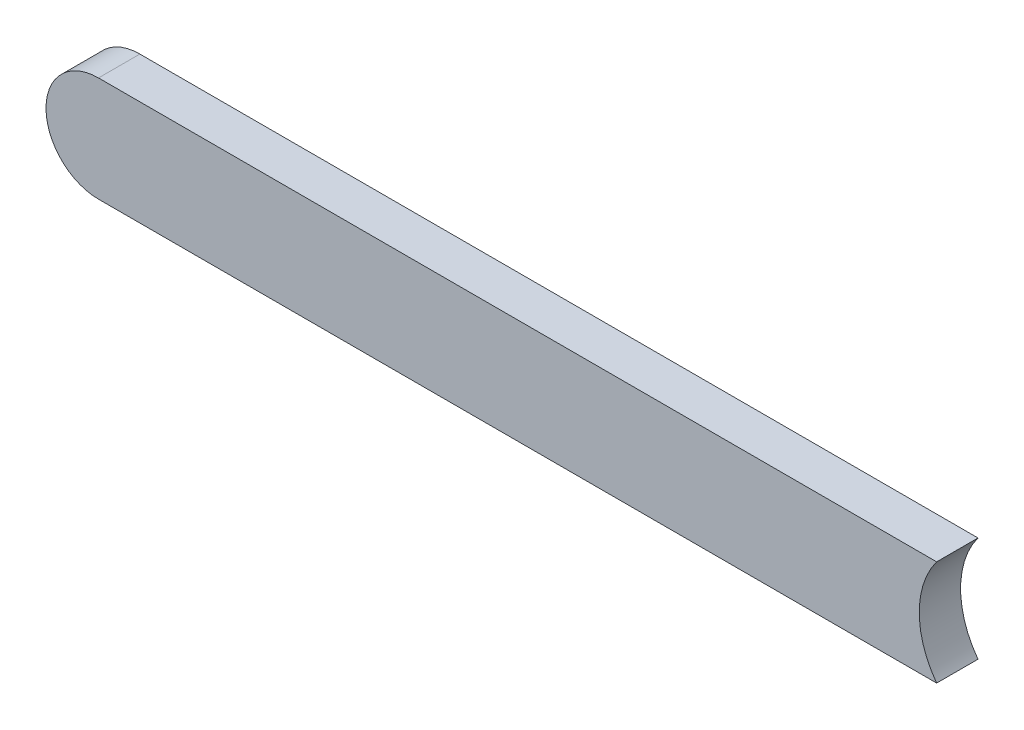
ISO-10303-21;
HEADER;
FILE_DESCRIPTION(('STEP AP214'),'2;1');
FILE_NAME('part.step','',(''),(''),'','','');
FILE_SCHEMA(('AUTOMOTIVE_DESIGN { 1 0 10303 214 1 1 1 1 }'));
ENDSEC;
DATA;
#1=APPLICATION_CONTEXT('core data for automotive mechanical design processes');
#2=APPLICATION_PROTOCOL_DEFINITION('international standard','automotive_design',2000,#1);
#3=PRODUCT_CONTEXT('',#1,'mechanical');
#4=PRODUCT('Part','Part','',(#3));
#5=PRODUCT_RELATED_PRODUCT_CATEGORY('part','',(#4));
#6=PRODUCT_DEFINITION_FORMATION('','',#4);
#7=PRODUCT_DEFINITION_CONTEXT('part definition',#1,'design');
#8=PRODUCT_DEFINITION('design','',#6,#7);
#9=PRODUCT_DEFINITION_SHAPE('','',#8);
#10=(LENGTH_UNIT() NAMED_UNIT(*) SI_UNIT(.MILLI.,.METRE.));
#11=(NAMED_UNIT(*) PLANE_ANGLE_UNIT() SI_UNIT($,.RADIAN.));
#12=(NAMED_UNIT(*) SI_UNIT($,.STERADIAN.) SOLID_ANGLE_UNIT());
#13=UNCERTAINTY_MEASURE_WITH_UNIT(LENGTH_MEASURE(1.E-05),#10,'distance_accuracy_value','');
#14=(GEOMETRIC_REPRESENTATION_CONTEXT(3) GLOBAL_UNCERTAINTY_ASSIGNED_CONTEXT((#13)) GLOBAL_UNIT_ASSIGNED_CONTEXT((#10,
#11,#12)) REPRESENTATION_CONTEXT('',''));
#15=CARTESIAN_POINT('',(0.,0.,0.));
#16=DIRECTION('',(0.,0.,1.));
#17=DIRECTION('',(1.,0.,0.));
#18=AXIS2_PLACEMENT_3D('',#15,#16,#17);
#19=CARTESIAN_POINT('',(145.464784,61.390784,0.));
#20=DIRECTION('',(0.,1.,0.));
#21=DIRECTION('',(1.,0.,0.));
#22=AXIS2_PLACEMENT_3D('',#19,#20,#21);
#23=PLANE('',#22);
#24=DIRECTION('',(1.,0.,0.));
#25=VECTOR('',#24,1.);
#26=CARTESIAN_POINT('',(145.464784,61.390784,0.1999996));
#27=LINE('',#26,#25);
#28=CARTESIAN_POINT('',(145.464784,61.390784,0.1999996));
#29=VERTEX_POINT('',#28);
#30=CARTESIAN_POINT('',(149.519251768896,61.390784,0.1999996));
#31=VERTEX_POINT('',#30);
#32=EDGE_CURVE('E11',#29,#31,#27,.T.);
#33=ORIENTED_EDGE('',*,*,#32,.F.);
#34=DIRECTION('',(0.,0.,1.));
#35=VECTOR('',#34,1.);
#36=CARTESIAN_POINT('',(145.464784,61.390784,0.));
#37=LINE('',#36,#35);
#38=CARTESIAN_POINT('',(145.464784,61.390784,0.));
#39=VERTEX_POINT('',#38);
#40=EDGE_CURVE('E24',#39,#29,#37,.T.);
#41=ORIENTED_EDGE('',*,*,#40,.F.);
#42=DIRECTION('',(1.,0.,0.));
#43=VECTOR('',#42,1.);
#44=CARTESIAN_POINT('',(145.464784,61.390784,0.));
#45=LINE('',#44,#43);
#46=CARTESIAN_POINT('',(149.519251768896,61.390784,0.));
#47=VERTEX_POINT('',#46);
#48=EDGE_CURVE('E75',#39,#47,#45,.T.);
#49=ORIENTED_EDGE('',*,*,#48,.T.);
#50=DIRECTION('',(0.,0.,1.));
#51=VECTOR('',#50,1.);
#52=CARTESIAN_POINT('',(149.519251768896,61.390784,0.));
#53=LINE('',#52,#51);
#54=EDGE_CURVE('E37',#47,#31,#53,.T.);
#55=ORIENTED_EDGE('',*,*,#54,.T.);
#56=EDGE_LOOP('',(#33,#41,#49,#55));
#57=FACE_BOUND('',#56,.T.);
#58=ADVANCED_FACE('F17',(#57),#23,.F.);
#59=CARTESIAN_POINT('',(149.86,61.644784,0.));
#60=DIRECTION('',(0.,0.,-1.));
#61=DIRECTION('',(1.,0.,0.));
#62=AXIS2_PLACEMENT_3D('',#59,#60,#61);
#63=CYLINDRICAL_SURFACE('',#62,0.42500042);
#64=DIRECTION('',(0.,0.,1.));
#65=VECTOR('',#64,1.);
#66=CARTESIAN_POINT('',(149.519251768896,61.898784,0.));
#67=LINE('',#66,#65);
#68=CARTESIAN_POINT('',(149.519251768896,61.898784,0.));
#69=VERTEX_POINT('',#68);
#70=CARTESIAN_POINT('',(149.519251768896,61.898784,0.1999996));
#71=VERTEX_POINT('',#70);
#72=EDGE_CURVE('E67',#69,#71,#67,.T.);
#73=ORIENTED_EDGE('',*,*,#72,.T.);
#74=CARTESIAN_POINT('',(149.86,61.644784,0.1999996));
#75=DIRECTION('',(0.,0.,1.));
#76=DIRECTION('',(1.,0.,0.));
#77=AXIS2_PLACEMENT_3D('',#74,#75,#76);
#78=CIRCLE('',#77,0.42500042);
#79=EDGE_CURVE('E82',#71,#31,#78,.T.);
#80=ORIENTED_EDGE('',*,*,#79,.T.);
#81=ORIENTED_EDGE('',*,*,#54,.F.);
#82=CARTESIAN_POINT('',(149.86,61.644784,0.));
#83=DIRECTION('',(0.,0.,1.));
#84=DIRECTION('',(1.,0.,0.));
#85=AXIS2_PLACEMENT_3D('',#82,#83,#84);
#86=CIRCLE('',#85,0.42500042);
#87=EDGE_CURVE('E80',#69,#47,#86,.T.);
#88=ORIENTED_EDGE('',*,*,#87,.F.);
#89=EDGE_LOOP('',(#73,#80,#81,#88));
#90=FACE_BOUND('',#89,.T.);
#91=ADVANCED_FACE('F88',(#90),#63,.F.);
#92=CARTESIAN_POINT('',(149.519251768896,61.898784,0.));
#93=DIRECTION('',(0.,-1.,0.));
#94=DIRECTION('',(-1.,0.,0.));
#95=AXIS2_PLACEMENT_3D('',#92,#93,#94);
#96=PLANE('',#95);
#97=DIRECTION('',(-1.,0.,0.));
#98=VECTOR('',#97,1.);
#99=CARTESIAN_POINT('',(149.86,61.898784,0.1999996));
#100=LINE('',#99,#98);
#101=CARTESIAN_POINT('',(145.464784,61.898784,0.1999996));
#102=VERTEX_POINT('',#101);
#103=EDGE_CURVE('E71',#71,#102,#100,.T.);
#104=ORIENTED_EDGE('',*,*,#103,.F.);
#105=ORIENTED_EDGE('',*,*,#72,.F.);
#106=DIRECTION('',(-1.,0.,0.));
#107=VECTOR('',#106,1.);
#108=CARTESIAN_POINT('',(149.86,61.898784,0.));
#109=LINE('',#108,#107);
#110=CARTESIAN_POINT('',(145.464784,61.898784,0.));
#111=VERTEX_POINT('',#110);
#112=EDGE_CURVE('E63',#69,#111,#109,.T.);
#113=ORIENTED_EDGE('',*,*,#112,.T.);
#114=DIRECTION('',(0.,0.,1.));
#115=VECTOR('',#114,1.);
#116=CARTESIAN_POINT('',(145.464784,61.898784,0.));
#117=LINE('',#116,#115);
#118=EDGE_CURVE('E53',#111,#102,#117,.T.);
#119=ORIENTED_EDGE('',*,*,#118,.T.);
#120=EDGE_LOOP('',(#104,#105,#113,#119));
#121=FACE_BOUND('',#120,.T.);
#122=ADVANCED_FACE('F66',(#121),#96,.F.);
#123=CARTESIAN_POINT('',(145.464784,61.644784,0.));
#124=DIRECTION('',(0.,0.,-1.));
#125=DIRECTION('',(-1.11896493820486E-13,1.,0.));
#126=AXIS2_PLACEMENT_3D('',#123,#124,#125);
#127=CYLINDRICAL_SURFACE('',#126,0.254000000000007);
#128=CARTESIAN_POINT('',(145.464784,61.644784,0.1999996));
#129=DIRECTION('',(0.,0.,1.));
#130=DIRECTION('',(-1.11896493820486E-13,1.,0.));
#131=AXIS2_PLACEMENT_3D('',#128,#129,#130);
#132=CIRCLE('',#131,0.254000000000007);
#133=EDGE_CURVE('E59',#102,#29,#132,.T.);
#134=ORIENTED_EDGE('',*,*,#133,.F.);
#135=ORIENTED_EDGE('',*,*,#118,.F.);
#136=CARTESIAN_POINT('',(145.464784,61.644784,0.));
#137=DIRECTION('',(0.,0.,1.));
#138=DIRECTION('',(-1.11896493820486E-13,1.,0.));
#139=AXIS2_PLACEMENT_3D('',#136,#137,#138);
#140=CIRCLE('',#139,0.254000000000007);
#141=EDGE_CURVE('E57',#111,#39,#140,.T.);
#142=ORIENTED_EDGE('',*,*,#141,.T.);
#143=ORIENTED_EDGE('',*,*,#40,.T.);
#144=EDGE_LOOP('',(#134,#135,#142,#143));
#145=FACE_BOUND('',#144,.T.);
#146=ADVANCED_FACE('F55',(#145),#127,.T.);
#147=CARTESIAN_POINT('',(145.464784,61.390784,0.));
#148=DIRECTION('',(0.,0.,-1.));
#149=DIRECTION('',(-1.,0.,0.));
#150=AXIS2_PLACEMENT_3D('',#147,#148,#149);
#151=PLANE('',#150);
#152=ORIENTED_EDGE('',*,*,#48,.F.);
#153=ORIENTED_EDGE('',*,*,#141,.F.);
#154=ORIENTED_EDGE('',*,*,#112,.F.);
#155=ORIENTED_EDGE('',*,*,#87,.T.);
#156=EDGE_LOOP('',(#152,#153,#154,#155));
#157=FACE_BOUND('',#156,.T.);
#158=ADVANCED_FACE('F74',(#157),#151,.T.);
#159=CARTESIAN_POINT('',(145.464784,61.390784,0.1999996));
#160=DIRECTION('',(0.,0.,-1.));
#161=DIRECTION('',(-1.,0.,0.));
#162=AXIS2_PLACEMENT_3D('',#159,#160,#161);
#163=PLANE('',#162);
#164=ORIENTED_EDGE('',*,*,#133,.T.);
#165=ORIENTED_EDGE('',*,*,#32,.T.);
#166=ORIENTED_EDGE('',*,*,#79,.F.);
#167=ORIENTED_EDGE('',*,*,#103,.T.);
#168=EDGE_LOOP('',(#164,#165,#166,#167));
#169=FACE_BOUND('',#168,.T.);
#170=ADVANCED_FACE('F91',(#169),#163,.F.);
#171=CLOSED_SHELL('',(#58,#91,#122,#146,#158,#170));
#172=MANIFOLD_SOLID_BREP('B1',#171);
#173=ADVANCED_BREP_SHAPE_REPRESENTATION('',(#18,#172),#14);
#174=SHAPE_DEFINITION_REPRESENTATION(#9,#173);
ENDSEC;
END-ISO-10303-21;
